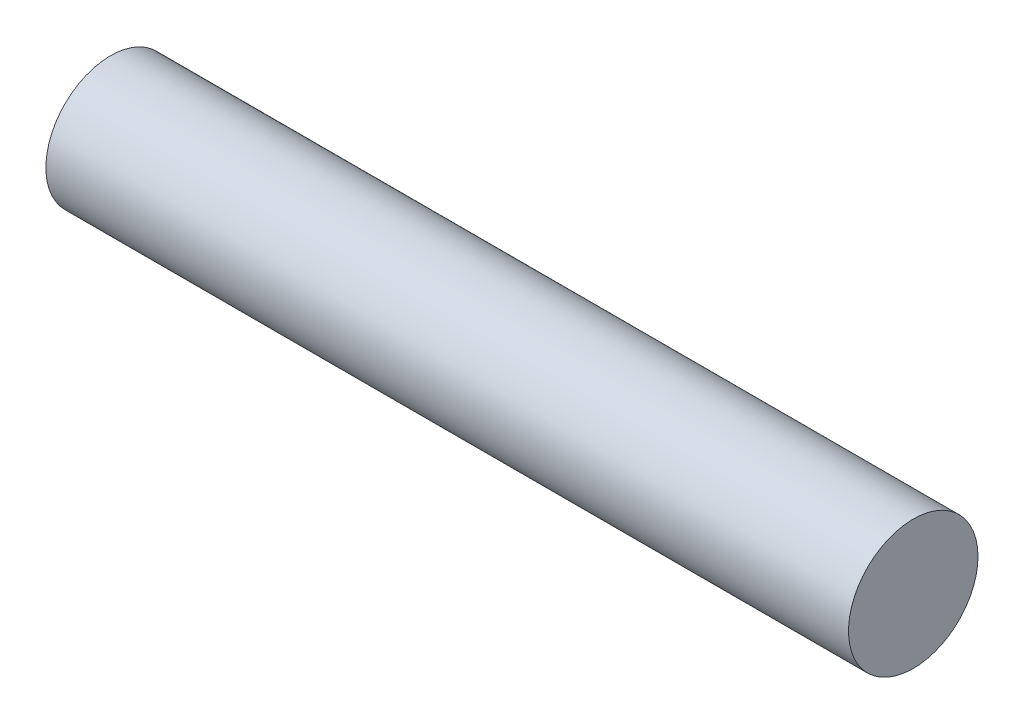
ISO-10303-21;
HEADER;
FILE_DESCRIPTION(('STEP AP214'),'2;1');
FILE_NAME('part.step','',(''),(''),'','','');
FILE_SCHEMA(('AUTOMOTIVE_DESIGN { 1 0 10303 214 1 1 1 1 }'));
ENDSEC;
DATA;
#1=APPLICATION_CONTEXT('core data for automotive mechanical design processes');
#2=APPLICATION_PROTOCOL_DEFINITION('international standard','automotive_design',2000,#1);
#3=PRODUCT_CONTEXT('',#1,'mechanical');
#4=PRODUCT('Part','Part','',(#3));
#5=PRODUCT_RELATED_PRODUCT_CATEGORY('part','',(#4));
#6=PRODUCT_DEFINITION_FORMATION('','',#4);
#7=PRODUCT_DEFINITION_CONTEXT('part definition',#1,'design');
#8=PRODUCT_DEFINITION('design','',#6,#7);
#9=PRODUCT_DEFINITION_SHAPE('','',#8);
#10=(LENGTH_UNIT() NAMED_UNIT(*) SI_UNIT(.MILLI.,.METRE.));
#11=(NAMED_UNIT(*) PLANE_ANGLE_UNIT() SI_UNIT($,.RADIAN.));
#12=(NAMED_UNIT(*) SI_UNIT($,.STERADIAN.) SOLID_ANGLE_UNIT());
#13=UNCERTAINTY_MEASURE_WITH_UNIT(LENGTH_MEASURE(1.E-05),#10,'distance_accuracy_value','');
#14=(GEOMETRIC_REPRESENTATION_CONTEXT(3) GLOBAL_UNCERTAINTY_ASSIGNED_CONTEXT((#13)) GLOBAL_UNIT_ASSIGNED_CONTEXT((#10,
#11,#12)) REPRESENTATION_CONTEXT('',''));
#15=CARTESIAN_POINT('',(0.,0.,0.));
#16=DIRECTION('',(0.,0.,1.));
#17=DIRECTION('',(1.,0.,0.));
#18=AXIS2_PLACEMENT_3D('',#15,#16,#17);
#19=CARTESIAN_POINT('',(15.5,0.,0.));
#20=DIRECTION('',(-1.,0.,0.));
#21=DIRECTION('',(0.,0.,1.));
#22=AXIS2_PLACEMENT_3D('',#19,#20,#21);
#23=CYLINDRICAL_SURFACE('',#22,2.5);
#24=CARTESIAN_POINT('',(15.5,0.,0.));
#25=DIRECTION('',(1.,0.,0.));
#26=DIRECTION('',(0.,0.,-1.));
#27=AXIS2_PLACEMENT_3D('',#24,#25,#26);
#28=CIRCLE('',#27,2.5);
#29=CARTESIAN_POINT('',(15.5,0.,-2.5));
#30=VERTEX_POINT('',#29);
#31=EDGE_CURVE('E10',#30,#30,#28,.T.);
#32=ORIENTED_EDGE('',*,*,#31,.F.);
#33=EDGE_LOOP('',(#32));
#34=FACE_BOUND('',#33,.T.);
#35=CARTESIAN_POINT('',(-15.5,0.,0.));
#36=DIRECTION('',(1.,0.,0.));
#37=DIRECTION('',(0.,0.,-1.));
#38=AXIS2_PLACEMENT_3D('',#35,#36,#37);
#39=CIRCLE('',#38,2.5);
#40=CARTESIAN_POINT('',(-15.5,0.,-2.5));
#41=VERTEX_POINT('',#40);
#42=EDGE_CURVE('E36',#41,#41,#39,.T.);
#43=ORIENTED_EDGE('',*,*,#42,.T.);
#44=EDGE_LOOP('',(#43));
#45=FACE_BOUND('',#44,.T.);
#46=ADVANCED_FACE('F33',(#34,#45),#23,.T.);
#47=CARTESIAN_POINT('',(15.5,0.,0.));
#48=DIRECTION('',(1.,0.,0.));
#49=DIRECTION('',(0.,0.,-1.));
#50=AXIS2_PLACEMENT_3D('',#47,#48,#49);
#51=PLANE('',#50);
#52=ORIENTED_EDGE('',*,*,#31,.T.);
#53=EDGE_LOOP('',(#52));
#54=FACE_BOUND('',#53,.T.);
#55=ADVANCED_FACE('F48',(#54),#51,.T.);
#56=CARTESIAN_POINT('',(-15.5,0.,0.));
#57=DIRECTION('',(1.,0.,0.));
#58=DIRECTION('',(0.,0.,-1.));
#59=AXIS2_PLACEMENT_3D('',#56,#57,#58);
#60=PLANE('',#59);
#61=ORIENTED_EDGE('',*,*,#42,.F.);
#62=EDGE_LOOP('',(#61));
#63=FACE_BOUND('',#62,.T.);
#64=ADVANCED_FACE('F46',(#63),#60,.F.);
#65=CLOSED_SHELL('',(#46,#55,#64));
#66=MANIFOLD_SOLID_BREP('B2',#65);
#67=ADVANCED_BREP_SHAPE_REPRESENTATION('',(#18,#66),#14);
#68=SHAPE_DEFINITION_REPRESENTATION(#9,#67);
ENDSEC;
END-ISO-10303-21;
